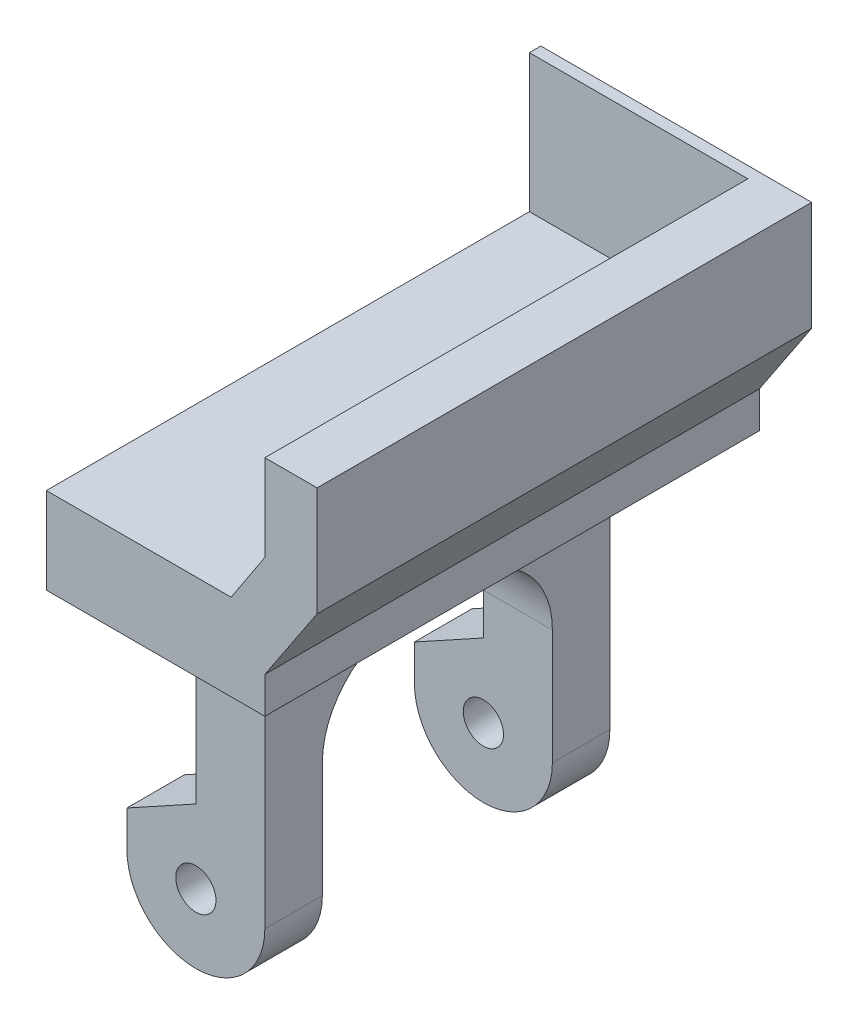
ISO-10303-21;
HEADER;
FILE_DESCRIPTION(('STEP AP214'),'2;1');
FILE_NAME('part.step','',(''),(''),'','','');
FILE_SCHEMA(('AUTOMOTIVE_DESIGN { 1 0 10303 214 1 1 1 1 }'));
ENDSEC;
DATA;
#1=APPLICATION_CONTEXT('core data for automotive mechanical design processes');
#2=APPLICATION_PROTOCOL_DEFINITION('international standard','automotive_design',2000,#1);
#3=PRODUCT_CONTEXT('',#1,'mechanical');
#4=PRODUCT('Part','Part','',(#3));
#5=PRODUCT_RELATED_PRODUCT_CATEGORY('part','',(#4));
#6=PRODUCT_DEFINITION_FORMATION('','',#4);
#7=PRODUCT_DEFINITION_CONTEXT('part definition',#1,'design');
#8=PRODUCT_DEFINITION('design','',#6,#7);
#9=PRODUCT_DEFINITION_SHAPE('','',#8);
#10=(LENGTH_UNIT() NAMED_UNIT(*) SI_UNIT(.MILLI.,.METRE.));
#11=(NAMED_UNIT(*) PLANE_ANGLE_UNIT() SI_UNIT($,.RADIAN.));
#12=(NAMED_UNIT(*) SI_UNIT($,.STERADIAN.) SOLID_ANGLE_UNIT());
#13=UNCERTAINTY_MEASURE_WITH_UNIT(LENGTH_MEASURE(1.E-05),#10,'distance_accuracy_value','');
#14=(GEOMETRIC_REPRESENTATION_CONTEXT(3) GLOBAL_UNCERTAINTY_ASSIGNED_CONTEXT((#13)) GLOBAL_UNIT_ASSIGNED_CONTEXT((#10,
#11,#12)) REPRESENTATION_CONTEXT('',''));
#15=CARTESIAN_POINT('',(0.,0.,0.));
#16=DIRECTION('',(0.,0.,1.));
#17=DIRECTION('',(1.,0.,0.));
#18=AXIS2_PLACEMENT_3D('',#15,#16,#17);
#19=CARTESIAN_POINT('',(0.,60.,0.));
#20=DIRECTION('',(0.,1.,0.));
#21=DIRECTION('',(0.,0.,1.));
#22=AXIS2_PLACEMENT_3D('',#19,#20,#21);
#23=PLANE('',#22);
#24=DIRECTION('',(0.,0.,1.));
#25=VECTOR('',#24,1.);
#26=CARTESIAN_POINT('',(19.1369547536123,60.,-12.));
#27=LINE('',#26,#25);
#28=CARTESIAN_POINT('',(19.1369547536123,60.,-11.));
#29=VERTEX_POINT('',#28);
#30=CARTESIAN_POINT('',(19.1369547536123,60.,73.));
#31=VERTEX_POINT('',#30);
#32=EDGE_CURVE('E271',#29,#31,#27,.T.);
#33=ORIENTED_EDGE('',*,*,#32,.F.);
#34=DIRECTION('',(-1.,0.,0.));
#35=VECTOR('',#34,1.);
#36=CARTESIAN_POINT('',(0.,60.,-11.));
#37=LINE('',#36,#35);
#38=CARTESIAN_POINT('',(-13.,60.,-11.));
#39=VERTEX_POINT('',#38);
#40=EDGE_CURVE('E248',#29,#39,#37,.T.);
#41=ORIENTED_EDGE('',*,*,#40,.T.);
#42=DIRECTION('',(0.,0.,1.));
#43=VECTOR('',#42,1.);
#44=CARTESIAN_POINT('',(-13.,60.,-13.));
#45=LINE('',#44,#43);
#46=CARTESIAN_POINT('',(-13.,60.,73.));
#47=VERTEX_POINT('',#46);
#48=EDGE_CURVE('E214',#39,#47,#45,.T.);
#49=ORIENTED_EDGE('',*,*,#48,.T.);
#50=DIRECTION('',(1.,0.,0.));
#51=VECTOR('',#50,1.);
#52=CARTESIAN_POINT('',(-13.,60.,73.));
#53=LINE('',#52,#51);
#54=EDGE_CURVE('E289',#47,#31,#53,.T.);
#55=ORIENTED_EDGE('',*,*,#54,.T.);
#56=EDGE_LOOP('',(#33,#41,#49,#55));
#57=FACE_BOUND('',#56,.T.);
#58=ADVANCED_FACE('F47',(#57),#23,.T.);
#59=CARTESIAN_POINT('',(25.,68.9267717162526,-12.));
#60=DIRECTION('',(-0.835839488356545,0.54897390621401,0.));
#61=DIRECTION('',(-0.54897390621401,-0.835839488356545,0.));
#62=AXIS2_PLACEMENT_3D('',#59,#60,#61);
#63=PLANE('',#62);
#64=DIRECTION('',(0.,0.,1.));
#65=VECTOR('',#64,1.);
#66=CARTESIAN_POINT('',(25.,68.9267717162526,-12.));
#67=LINE('',#66,#65);
#68=CARTESIAN_POINT('',(25.,68.9267717162526,-11.));
#69=VERTEX_POINT('',#68);
#70=CARTESIAN_POINT('',(25.,68.9267717162526,73.));
#71=VERTEX_POINT('',#70);
#72=EDGE_CURVE('E275',#69,#71,#67,.T.);
#73=ORIENTED_EDGE('',*,*,#72,.F.);
#74=DIRECTION('',(-0.54897390621401,-0.835839488356545,0.));
#75=VECTOR('',#74,1.);
#76=CARTESIAN_POINT('',(25.,68.9267717162526,-11.));
#77=LINE('',#76,#75);
#78=EDGE_CURVE('E63',#69,#29,#77,.T.);
#79=ORIENTED_EDGE('',*,*,#78,.T.);
#80=ORIENTED_EDGE('',*,*,#32,.T.);
#81=DIRECTION('',(-0.54897390621401,-0.835839488356545,0.));
#82=VECTOR('',#81,1.);
#83=CARTESIAN_POINT('',(25.,68.9267717162526,73.));
#84=LINE('',#83,#82);
#85=EDGE_CURVE('E267',#71,#31,#84,.T.);
#86=ORIENTED_EDGE('',*,*,#85,.F.);
#87=EDGE_LOOP('',(#73,#79,#80,#86));
#88=FACE_BOUND('',#87,.T.);
#89=ADVANCED_FACE('F560',(#88),#63,.T.);
#90=CARTESIAN_POINT('',(25.,83.9469624959183,-12.));
#91=DIRECTION('',(-1.,0.,0.));
#92=DIRECTION('',(0.,0.,1.));
#93=AXIS2_PLACEMENT_3D('',#90,#91,#92);
#94=PLANE('',#93);
#95=DIRECTION('',(0.,0.,1.));
#96=VECTOR('',#95,1.);
#97=CARTESIAN_POINT('',(25.,83.9469624959183,-12.));
#98=LINE('',#97,#96);
#99=CARTESIAN_POINT('',(25.,83.9469624959183,-11.));
#100=VERTEX_POINT('',#99);
#101=CARTESIAN_POINT('',(25.,83.9469624959183,73.));
#102=VERTEX_POINT('',#101);
#103=EDGE_CURVE('E278',#100,#102,#98,.T.);
#104=ORIENTED_EDGE('',*,*,#103,.F.);
#105=DIRECTION('',(0.,-1.,0.));
#106=VECTOR('',#105,1.);
#107=CARTESIAN_POINT('',(25.,83.9469624959183,-11.));
#108=LINE('',#107,#106);
#109=EDGE_CURVE('E228',#100,#69,#108,.T.);
#110=ORIENTED_EDGE('',*,*,#109,.T.);
#111=ORIENTED_EDGE('',*,*,#72,.T.);
#112=DIRECTION('',(0.,-1.,0.));
#113=VECTOR('',#112,1.);
#114=CARTESIAN_POINT('',(25.,83.9469624959183,73.));
#115=LINE('',#114,#113);
#116=EDGE_CURVE('E263',#102,#71,#115,.T.);
#117=ORIENTED_EDGE('',*,*,#116,.F.);
#118=EDGE_LOOP('',(#104,#110,#111,#117));
#119=FACE_BOUND('',#118,.T.);
#120=ADVANCED_FACE('F566',(#119),#94,.T.);
#121=CARTESIAN_POINT('',(0.,0.,50.));
#122=DIRECTION('',(0.,0.,-1.));
#123=DIRECTION('',(1.,0.,0.));
#124=AXIS2_PLACEMENT_3D('',#121,#122,#123);
#125=PLANE('',#124);
#126=DIRECTION('',(0.,-1.,0.));
#127=VECTOR('',#126,1.);
#128=CARTESIAN_POINT('',(0.,12.7959520691142,50.));
#129=LINE('',#128,#127);
#130=CARTESIAN_POINT('',(0.,20.,50.));
#131=VERTEX_POINT('',#130);
#132=CARTESIAN_POINT('',(0.,12.7959520691142,50.));
#133=VERTEX_POINT('',#132);
#134=EDGE_CURVE('E420',#131,#133,#129,.T.);
#135=ORIENTED_EDGE('',*,*,#134,.F.);
#136=DIRECTION('',(-1.,0.,0.));
#137=VECTOR('',#136,1.);
#138=CARTESIAN_POINT('',(12.,20.,50.));
#139=LINE('',#138,#137);
#140=CARTESIAN_POINT('',(12.,20.,50.));
#141=VERTEX_POINT('',#140);
#142=EDGE_CURVE('E472',#131,#141,#139,.F.);
#143=ORIENTED_EDGE('',*,*,#142,.T.);
#144=DIRECTION('',(0.,1.,0.));
#145=VECTOR('',#144,1.);
#146=CARTESIAN_POINT('',(12.,0.,50.));
#147=LINE('',#146,#145);
#148=CARTESIAN_POINT('',(12.,0.,50.));
#149=VERTEX_POINT('',#148);
#150=EDGE_CURVE('E415',#149,#141,#147,.T.);
#151=ORIENTED_EDGE('',*,*,#150,.F.);
#152=CARTESIAN_POINT('',(0.,0.,50.));
#153=DIRECTION('',(0.,0.,1.));
#154=DIRECTION('',(1.,0.,0.));
#155=AXIS2_PLACEMENT_3D('',#152,#153,#154);
#156=CIRCLE('',#155,12.);
#157=CARTESIAN_POINT('',(-12.,0.,50.));
#158=VERTEX_POINT('',#157);
#159=EDGE_CURVE('E411',#158,#149,#156,.T.);
#160=ORIENTED_EDGE('',*,*,#159,.F.);
#161=DIRECTION('',(0.,-1.,0.));
#162=VECTOR('',#161,1.);
#163=CARTESIAN_POINT('',(-12.,0.,50.));
#164=LINE('',#163,#162);
#165=CARTESIAN_POINT('',(-12.,6.18899999857538,50.));
#166=VERTEX_POINT('',#165);
#167=EDGE_CURVE('E427',#166,#158,#164,.T.);
#168=ORIENTED_EDGE('',*,*,#167,.F.);
#169=DIRECTION('',(-0.876001521762733,-0.482308339000453,0.));
#170=VECTOR('',#169,1.);
#171=CARTESIAN_POINT('',(-12.,6.18899999857538,50.));
#172=LINE('',#171,#170);
#173=EDGE_CURVE('E423',#133,#166,#172,.T.);
#174=ORIENTED_EDGE('',*,*,#173,.F.);
#175=EDGE_LOOP('',(#135,#143,#151,#160,#168,#174));
#176=FACE_BOUND('',#175,.T.);
#177=CARTESIAN_POINT('',(0.,0.,50.));
#178=DIRECTION('',(0.,0.,1.));
#179=DIRECTION('',(1.,0.,0.));
#180=AXIS2_PLACEMENT_3D('',#177,#178,#179);
#181=CIRCLE('',#180,3.5);
#182=CARTESIAN_POINT('',(3.5,0.,50.));
#183=VERTEX_POINT('',#182);
#184=EDGE_CURVE('E403',#183,#183,#181,.T.);
#185=ORIENTED_EDGE('',*,*,#184,.T.);
#186=EDGE_LOOP('',(#185));
#187=FACE_BOUND('',#186,.T.);
#188=ADVANCED_FACE('F491',(#176,#187),#125,.T.);
#189=CARTESIAN_POINT('',(0.,0.,60.));
#190=DIRECTION('',(0.,0.,-1.));
#191=DIRECTION('',(1.,0.,0.));
#192=AXIS2_PLACEMENT_3D('',#189,#190,#191);
#193=PLANE('',#192);
#194=CARTESIAN_POINT('',(0.,0.,60.));
#195=DIRECTION('',(0.,0.,1.));
#196=DIRECTION('',(1.,0.,0.));
#197=AXIS2_PLACEMENT_3D('',#194,#195,#196);
#198=CIRCLE('',#197,12.);
#199=CARTESIAN_POINT('',(-12.,0.,60.));
#200=VERTEX_POINT('',#199);
#201=CARTESIAN_POINT('',(12.,0.,60.));
#202=VERTEX_POINT('',#201);
#203=EDGE_CURVE('E407',#200,#202,#198,.T.);
#204=ORIENTED_EDGE('',*,*,#203,.T.);
#205=DIRECTION('',(0.,1.,0.));
#206=VECTOR('',#205,1.);
#207=CARTESIAN_POINT('',(12.,0.,60.));
#208=LINE('',#207,#206);
#209=CARTESIAN_POINT('',(12.,45.,60.));
#210=VERTEX_POINT('',#209);
#211=EDGE_CURVE('E435',#202,#210,#208,.T.);
#212=ORIENTED_EDGE('',*,*,#211,.T.);
#213=DIRECTION('',(1.,0.,0.));
#214=VECTOR('',#213,1.);
#215=CARTESIAN_POINT('',(0.,45.,60.));
#216=LINE('',#215,#214);
#217=CARTESIAN_POINT('',(0.,45.,60.));
#218=VERTEX_POINT('',#217);
#219=EDGE_CURVE('E392',#218,#210,#216,.T.);
#220=ORIENTED_EDGE('',*,*,#219,.F.);
#221=DIRECTION('',(0.,-1.,0.));
#222=VECTOR('',#221,1.);
#223=CARTESIAN_POINT('',(0.,12.7959520691142,60.));
#224=LINE('',#223,#222);
#225=CARTESIAN_POINT('',(0.,12.7959520691142,60.));
#226=VERTEX_POINT('',#225);
#227=EDGE_CURVE('E439',#218,#226,#224,.T.);
#228=ORIENTED_EDGE('',*,*,#227,.T.);
#229=DIRECTION('',(-0.876001521762733,-0.482308339000453,0.));
#230=VECTOR('',#229,1.);
#231=CARTESIAN_POINT('',(-12.,6.18899999857538,60.));
#232=LINE('',#231,#230);
#233=CARTESIAN_POINT('',(-12.,6.18899999857538,60.));
#234=VERTEX_POINT('',#233);
#235=EDGE_CURVE('E443',#226,#234,#232,.T.);
#236=ORIENTED_EDGE('',*,*,#235,.T.);
#237=DIRECTION('',(0.,-1.,0.));
#238=VECTOR('',#237,1.);
#239=CARTESIAN_POINT('',(-12.,0.,60.));
#240=LINE('',#239,#238);
#241=EDGE_CURVE('E416',#234,#200,#240,.T.);
#242=ORIENTED_EDGE('',*,*,#241,.T.);
#243=EDGE_LOOP('',(#204,#212,#220,#228,#236,#242));
#244=FACE_BOUND('',#243,.T.);
#245=CARTESIAN_POINT('',(0.,0.,60.));
#246=DIRECTION('',(0.,0.,1.));
#247=DIRECTION('',(1.,0.,0.));
#248=AXIS2_PLACEMENT_3D('',#245,#246,#247);
#249=CIRCLE('',#248,3.5);
#250=CARTESIAN_POINT('',(3.5,0.,60.));
#251=VERTEX_POINT('',#250);
#252=EDGE_CURVE('E402',#251,#251,#249,.T.);
#253=ORIENTED_EDGE('',*,*,#252,.F.);
#254=EDGE_LOOP('',(#253));
#255=FACE_BOUND('',#254,.T.);
#256=ADVANCED_FACE('F525',(#244,#255),#193,.F.);
#257=CARTESIAN_POINT('',(0.,0.,50.));
#258=DIRECTION('',(0.,0.,1.));
#259=DIRECTION('',(-1.,0.,0.));
#260=AXIS2_PLACEMENT_3D('',#257,#258,#259);
#261=CYLINDRICAL_SURFACE('',#260,12.);
#262=ORIENTED_EDGE('',*,*,#203,.F.);
#263=DIRECTION('',(0.,0.,1.));
#264=VECTOR('',#263,1.);
#265=CARTESIAN_POINT('',(-12.,0.,50.));
#266=LINE('',#265,#264);
#267=EDGE_CURVE('E431',#158,#200,#266,.T.);
#268=ORIENTED_EDGE('',*,*,#267,.F.);
#269=ORIENTED_EDGE('',*,*,#159,.T.);
#270=DIRECTION('',(0.,0.,1.));
#271=VECTOR('',#270,1.);
#272=CARTESIAN_POINT('',(12.,0.,50.));
#273=LINE('',#272,#271);
#274=EDGE_CURVE('E458',#149,#202,#273,.T.);
#275=ORIENTED_EDGE('',*,*,#274,.T.);
#276=EDGE_LOOP('',(#262,#268,#269,#275));
#277=FACE_BOUND('',#276,.T.);
#278=ADVANCED_FACE('F530',(#277),#261,.T.);
#279=CARTESIAN_POINT('',(12.,0.,50.));
#280=DIRECTION('',(-1.,0.,0.));
#281=DIRECTION('',(0.,0.,-1.));
#282=AXIS2_PLACEMENT_3D('',#279,#280,#281);
#283=PLANE('',#282);
#284=ORIENTED_EDGE('',*,*,#211,.F.);
#285=ORIENTED_EDGE('',*,*,#274,.F.);
#286=ORIENTED_EDGE('',*,*,#150,.T.);
#287=CARTESIAN_POINT('',(12.,20.,35.));
#288=DIRECTION('',(-1.,0.,0.));
#289=DIRECTION('',(0.,0.,1.));
#290=AXIS2_PLACEMENT_3D('',#287,#288,#289);
#291=CIRCLE('',#290,15.);
#292=CARTESIAN_POINT('',(12.,35.,35.));
#293=VERTEX_POINT('',#292);
#294=EDGE_CURVE('E11',#141,#293,#291,.T.);
#295=ORIENTED_EDGE('',*,*,#294,.T.);
#296=DIRECTION('',(0.,0.,1.));
#297=VECTOR('',#296,1.);
#298=CARTESIAN_POINT('',(12.,35.,10.));
#299=LINE('',#298,#297);
#300=CARTESIAN_POINT('',(12.,35.,25.));
#301=VERTEX_POINT('',#300);
#302=EDGE_CURVE('E321',#301,#293,#299,.T.);
#303=ORIENTED_EDGE('',*,*,#302,.F.);
#304=CARTESIAN_POINT('',(12.,20.,25.));
#305=DIRECTION('',(-1.,0.,0.));
#306=DIRECTION('',(0.,0.,1.));
#307=AXIS2_PLACEMENT_3D('',#304,#305,#306);
#308=CIRCLE('',#307,15.);
#309=CARTESIAN_POINT('',(12.,20.,10.));
#310=VERTEX_POINT('',#309);
#311=EDGE_CURVE('E475',#301,#310,#308,.T.);
#312=ORIENTED_EDGE('',*,*,#311,.T.);
#313=DIRECTION('',(0.,1.,0.));
#314=VECTOR('',#313,1.);
#315=CARTESIAN_POINT('',(12.,0.,10.));
#316=LINE('',#315,#314);
#317=CARTESIAN_POINT('',(12.,0.,10.));
#318=VERTEX_POINT('',#317);
#319=EDGE_CURVE('E342',#318,#310,#316,.T.);
#320=ORIENTED_EDGE('',*,*,#319,.F.);
#321=DIRECTION('',(0.,0.,-1.));
#322=VECTOR('',#321,1.);
#323=CARTESIAN_POINT('',(12.,0.,10.));
#324=LINE('',#323,#322);
#325=CARTESIAN_POINT('',(12.,0.,0.));
#326=VERTEX_POINT('',#325);
#327=EDGE_CURVE('E376',#318,#326,#324,.T.);
#328=ORIENTED_EDGE('',*,*,#327,.T.);
#329=DIRECTION('',(0.,-1.,0.));
#330=VECTOR('',#329,1.);
#331=CARTESIAN_POINT('',(12.,45.,0.));
#332=LINE('',#331,#330);
#333=CARTESIAN_POINT('',(12.,45.,0.));
#334=VERTEX_POINT('',#333);
#335=EDGE_CURVE('E399',#334,#326,#332,.T.);
#336=ORIENTED_EDGE('',*,*,#335,.F.);
#337=DIRECTION('',(0.,0.,-1.));
#338=VECTOR('',#337,1.);
#339=CARTESIAN_POINT('',(12.,45.,10.));
#340=LINE('',#339,#338);
#341=EDGE_CURVE('E380',#210,#334,#340,.T.);
#342=ORIENTED_EDGE('',*,*,#341,.F.);
#343=EDGE_LOOP('',(#284,#285,#286,#295,#303,#312,#320,#328,#336,#342));
#344=FACE_BOUND('',#343,.T.);
#345=ADVANCED_FACE('F499',(#344),#283,.F.);
#346=CARTESIAN_POINT('',(0.,12.7959520691142,50.));
#347=DIRECTION('',(1.,0.,0.));
#348=DIRECTION('',(0.,0.,1.));
#349=AXIS2_PLACEMENT_3D('',#346,#347,#348);
#350=PLANE('',#349);
#351=DIRECTION('',(0.,0.,-1.));
#352=VECTOR('',#351,1.);
#353=CARTESIAN_POINT('',(0.,35.,50.));
#354=LINE('',#353,#352);
#355=CARTESIAN_POINT('',(0.,35.,35.));
#356=VERTEX_POINT('',#355);
#357=CARTESIAN_POINT('',(0.,35.,25.));
#358=VERTEX_POINT('',#357);
#359=EDGE_CURVE('E325',#356,#358,#354,.T.);
#360=ORIENTED_EDGE('',*,*,#359,.F.);
#361=CARTESIAN_POINT('',(0.,20.,35.));
#362=DIRECTION('',(1.,0.,0.));
#363=DIRECTION('',(0.,0.,-1.));
#364=AXIS2_PLACEMENT_3D('',#361,#362,#363);
#365=CIRCLE('',#364,15.);
#366=EDGE_CURVE('E56',#356,#131,#365,.T.);
#367=ORIENTED_EDGE('',*,*,#366,.T.);
#368=ORIENTED_EDGE('',*,*,#134,.T.);
#369=DIRECTION('',(0.,0.,1.));
#370=VECTOR('',#369,1.);
#371=CARTESIAN_POINT('',(0.,12.7959520691142,50.));
#372=LINE('',#371,#370);
#373=EDGE_CURVE('E455',#133,#226,#372,.T.);
#374=ORIENTED_EDGE('',*,*,#373,.T.);
#375=ORIENTED_EDGE('',*,*,#227,.F.);
#376=DIRECTION('',(0.,0.,1.));
#377=VECTOR('',#376,1.);
#378=CARTESIAN_POINT('',(0.,45.,0.));
#379=LINE('',#378,#377);
#380=CARTESIAN_POINT('',(0.,45.,0.));
#381=VERTEX_POINT('',#380);
#382=EDGE_CURVE('E388',#381,#218,#379,.T.);
#383=ORIENTED_EDGE('',*,*,#382,.F.);
#384=DIRECTION('',(0.,-1.,0.));
#385=VECTOR('',#384,1.);
#386=CARTESIAN_POINT('',(0.,45.,0.));
#387=LINE('',#386,#385);
#388=CARTESIAN_POINT('',(0.,12.7959520691142,0.));
#389=VERTEX_POINT('',#388);
#390=EDGE_CURVE('E396',#381,#389,#387,.T.);
#391=ORIENTED_EDGE('',*,*,#390,.T.);
#392=DIRECTION('',(0.,0.,-1.));
#393=VECTOR('',#392,1.);
#394=CARTESIAN_POINT('',(0.,12.7959520691142,10.));
#395=LINE('',#394,#393);
#396=CARTESIAN_POINT('',(0.,12.7959520691142,10.));
#397=VERTEX_POINT('',#396);
#398=EDGE_CURVE('E372',#397,#389,#395,.T.);
#399=ORIENTED_EDGE('',*,*,#398,.F.);
#400=DIRECTION('',(0.,-1.,0.));
#401=VECTOR('',#400,1.);
#402=CARTESIAN_POINT('',(0.,12.7959520691142,10.));
#403=LINE('',#402,#401);
#404=CARTESIAN_POINT('',(0.,20.,10.));
#405=VERTEX_POINT('',#404);
#406=EDGE_CURVE('E347',#405,#397,#403,.T.);
#407=ORIENTED_EDGE('',*,*,#406,.F.);
#408=CARTESIAN_POINT('',(0.,20.,25.));
#409=DIRECTION('',(1.,0.,0.));
#410=DIRECTION('',(0.,0.,-1.));
#411=AXIS2_PLACEMENT_3D('',#408,#409,#410);
#412=CIRCLE('',#411,15.);
#413=EDGE_CURVE('E478',#405,#358,#412,.T.);
#414=ORIENTED_EDGE('',*,*,#413,.T.);
#415=EDGE_LOOP('',(#360,#367,#368,#374,#375,#383,#391,#399,#407,#414));
#416=FACE_BOUND('',#415,.T.);
#417=ADVANCED_FACE('F484',(#416),#350,.F.);
#418=CARTESIAN_POINT('',(-12.,6.18899999857538,50.));
#419=DIRECTION('',(0.482308339000453,-0.876001521762733,0.));
#420=DIRECTION('',(0.876001521762733,0.482308339000453,0.));
#421=AXIS2_PLACEMENT_3D('',#418,#419,#420);
#422=PLANE('',#421);
#423=ORIENTED_EDGE('',*,*,#235,.F.);
#424=ORIENTED_EDGE('',*,*,#373,.F.);
#425=ORIENTED_EDGE('',*,*,#173,.T.);
#426=DIRECTION('',(0.,0.,1.));
#427=VECTOR('',#426,1.);
#428=CARTESIAN_POINT('',(-12.,6.18899999857538,50.));
#429=LINE('',#428,#427);
#430=EDGE_CURVE('E452',#166,#234,#429,.T.);
#431=ORIENTED_EDGE('',*,*,#430,.T.);
#432=EDGE_LOOP('',(#423,#424,#425,#431));
#433=FACE_BOUND('',#432,.T.);
#434=ADVANCED_FACE('F536',(#433),#422,.F.);
#435=CARTESIAN_POINT('',(-12.,0.,50.));
#436=DIRECTION('',(1.,0.,0.));
#437=DIRECTION('',(0.,0.,1.));
#438=AXIS2_PLACEMENT_3D('',#435,#436,#437);
#439=PLANE('',#438);
#440=ORIENTED_EDGE('',*,*,#241,.F.);
#441=ORIENTED_EDGE('',*,*,#430,.F.);
#442=ORIENTED_EDGE('',*,*,#167,.T.);
#443=ORIENTED_EDGE('',*,*,#267,.T.);
#444=EDGE_LOOP('',(#440,#441,#442,#443));
#445=FACE_BOUND('',#444,.T.);
#446=ADVANCED_FACE('F533',(#445),#439,.F.);
#447=CARTESIAN_POINT('',(0.,0.,50.));
#448=DIRECTION('',(0.,0.,1.));
#449=DIRECTION('',(-1.,0.,0.));
#450=AXIS2_PLACEMENT_3D('',#447,#448,#449);
#451=CYLINDRICAL_SURFACE('',#450,3.5);
#452=ORIENTED_EDGE('',*,*,#184,.F.);
#453=EDGE_LOOP('',(#452));
#454=FACE_BOUND('',#453,.T.);
#455=ORIENTED_EDGE('',*,*,#252,.T.);
#456=EDGE_LOOP('',(#455));
#457=FACE_BOUND('',#456,.T.);
#458=ADVANCED_FACE('F597',(#454,#457),#451,.F.);
#459=CARTESIAN_POINT('',(12.,45.,0.));
#460=DIRECTION('',(0.,0.,1.));
#461=DIRECTION('',(1.,0.,0.));
#462=AXIS2_PLACEMENT_3D('',#459,#460,#461);
#463=PLANE('',#462);
#464=ORIENTED_EDGE('',*,*,#335,.T.);
#465=CARTESIAN_POINT('',(0.,0.,0.));
#466=DIRECTION('',(0.,0.,1.));
#467=DIRECTION('',(1.,0.,0.));
#468=AXIS2_PLACEMENT_3D('',#465,#466,#467);
#469=CIRCLE('',#468,12.);
#470=CARTESIAN_POINT('',(-12.,0.,0.));
#471=VERTEX_POINT('',#470);
#472=EDGE_CURVE('E334',#471,#326,#469,.T.);
#473=ORIENTED_EDGE('',*,*,#472,.F.);
#474=DIRECTION('',(0.,-1.,0.));
#475=VECTOR('',#474,1.);
#476=CARTESIAN_POINT('',(-12.,0.,0.));
#477=LINE('',#476,#475);
#478=CARTESIAN_POINT('',(-12.,6.18899999857538,0.));
#479=VERTEX_POINT('',#478);
#480=EDGE_CURVE('E343',#479,#471,#477,.T.);
#481=ORIENTED_EDGE('',*,*,#480,.F.);
#482=DIRECTION('',(-0.876001521762733,-0.482308339000453,0.));
#483=VECTOR('',#482,1.);
#484=CARTESIAN_POINT('',(-12.,6.18899999857538,0.));
#485=LINE('',#484,#483);
#486=EDGE_CURVE('E360',#389,#479,#485,.T.);
#487=ORIENTED_EDGE('',*,*,#486,.F.);
#488=ORIENTED_EDGE('',*,*,#390,.F.);
#489=DIRECTION('',(-1.,0.,0.));
#490=VECTOR('',#489,1.);
#491=CARTESIAN_POINT('',(12.,45.,0.));
#492=LINE('',#491,#490);
#493=EDGE_CURVE('E384',#334,#381,#492,.T.);
#494=ORIENTED_EDGE('',*,*,#493,.F.);
#495=EDGE_LOOP('',(#464,#473,#481,#487,#488,#494));
#496=FACE_BOUND('',#495,.T.);
#497=CARTESIAN_POINT('',(0.,0.,0.));
#498=DIRECTION('',(0.,0.,1.));
#499=DIRECTION('',(1.,0.,0.));
#500=AXIS2_PLACEMENT_3D('',#497,#498,#499);
#501=CIRCLE('',#500,3.5);
#502=CARTESIAN_POINT('',(3.5,0.,0.));
#503=VERTEX_POINT('',#502);
#504=EDGE_CURVE('E329',#503,#503,#501,.T.);
#505=ORIENTED_EDGE('',*,*,#504,.T.);
#506=EDGE_LOOP('',(#505));
#507=FACE_BOUND('',#506,.T.);
#508=ADVANCED_FACE('F544',(#496,#507),#463,.F.);
#509=CARTESIAN_POINT('',(0.,0.,10.));
#510=DIRECTION('',(0.,0.,1.));
#511=DIRECTION('',(1.,0.,0.));
#512=AXIS2_PLACEMENT_3D('',#509,#510,#511);
#513=PLANE('',#512);
#514=ORIENTED_EDGE('',*,*,#319,.T.);
#515=DIRECTION('',(1.,0.,0.));
#516=VECTOR('',#515,1.);
#517=CARTESIAN_POINT('',(0.,20.,10.));
#518=LINE('',#517,#516);
#519=EDGE_CURVE('E469',#310,#405,#518,.F.);
#520=ORIENTED_EDGE('',*,*,#519,.T.);
#521=ORIENTED_EDGE('',*,*,#406,.T.);
#522=DIRECTION('',(-0.876001521762733,-0.482308339000453,0.));
#523=VECTOR('',#522,1.);
#524=CARTESIAN_POINT('',(-12.,6.18899999857538,10.));
#525=LINE('',#524,#523);
#526=CARTESIAN_POINT('',(-12.,6.18899999857538,10.));
#527=VERTEX_POINT('',#526);
#528=EDGE_CURVE('E350',#397,#527,#525,.T.);
#529=ORIENTED_EDGE('',*,*,#528,.T.);
#530=DIRECTION('',(0.,-1.,0.));
#531=VECTOR('',#530,1.);
#532=CARTESIAN_POINT('',(-12.,0.,10.));
#533=LINE('',#532,#531);
#534=CARTESIAN_POINT('',(-12.,0.,10.));
#535=VERTEX_POINT('',#534);
#536=EDGE_CURVE('E353',#527,#535,#533,.T.);
#537=ORIENTED_EDGE('',*,*,#536,.T.);
#538=CARTESIAN_POINT('',(0.,0.,10.));
#539=DIRECTION('',(0.,0.,1.));
#540=DIRECTION('',(1.,0.,0.));
#541=AXIS2_PLACEMENT_3D('',#538,#539,#540);
#542=CIRCLE('',#541,12.);
#543=EDGE_CURVE('E338',#535,#318,#542,.T.);
#544=ORIENTED_EDGE('',*,*,#543,.T.);
#545=EDGE_LOOP('',(#514,#520,#521,#529,#537,#544));
#546=FACE_BOUND('',#545,.T.);
#547=CARTESIAN_POINT('',(0.,0.,10.));
#548=DIRECTION('',(0.,0.,1.));
#549=DIRECTION('',(1.,0.,0.));
#550=AXIS2_PLACEMENT_3D('',#547,#548,#549);
#551=CIRCLE('',#550,3.5);
#552=CARTESIAN_POINT('',(3.5,0.,10.));
#553=VERTEX_POINT('',#552);
#554=EDGE_CURVE('E330',#553,#553,#551,.T.);
#555=ORIENTED_EDGE('',*,*,#554,.F.);
#556=EDGE_LOOP('',(#555));
#557=FACE_BOUND('',#556,.T.);
#558=ADVANCED_FACE('F508',(#546,#557),#513,.T.);
#559=CARTESIAN_POINT('',(0.,0.,10.));
#560=DIRECTION('',(0.,0.,-1.));
#561=DIRECTION('',(-1.,0.,0.));
#562=AXIS2_PLACEMENT_3D('',#559,#560,#561);
#563=CYLINDRICAL_SURFACE('',#562,12.);
#564=ORIENTED_EDGE('',*,*,#472,.T.);
#565=ORIENTED_EDGE('',*,*,#327,.F.);
#566=ORIENTED_EDGE('',*,*,#543,.F.);
#567=DIRECTION('',(0.,0.,-1.));
#568=VECTOR('',#567,1.);
#569=CARTESIAN_POINT('',(-12.,0.,10.));
#570=LINE('',#569,#568);
#571=EDGE_CURVE('E356',#535,#471,#570,.T.);
#572=ORIENTED_EDGE('',*,*,#571,.T.);
#573=EDGE_LOOP('',(#564,#565,#566,#572));
#574=FACE_BOUND('',#573,.T.);
#575=ADVANCED_FACE('F516',(#574),#563,.T.);
#576=CARTESIAN_POINT('',(-12.,6.18899999857538,10.));
#577=DIRECTION('',(0.482308339000453,-0.876001521762733,0.));
#578=DIRECTION('',(0.876001521762733,0.482308339000453,0.));
#579=AXIS2_PLACEMENT_3D('',#576,#577,#578);
#580=PLANE('',#579);
#581=ORIENTED_EDGE('',*,*,#486,.T.);
#582=DIRECTION('',(0.,0.,-1.));
#583=VECTOR('',#582,1.);
#584=CARTESIAN_POINT('',(-12.,6.18899999857538,10.));
#585=LINE('',#584,#583);
#586=EDGE_CURVE('E368',#527,#479,#585,.T.);
#587=ORIENTED_EDGE('',*,*,#586,.F.);
#588=ORIENTED_EDGE('',*,*,#528,.F.);
#589=ORIENTED_EDGE('',*,*,#398,.T.);
#590=EDGE_LOOP('',(#581,#587,#588,#589));
#591=FACE_BOUND('',#590,.T.);
#592=ADVANCED_FACE('F541',(#591),#580,.F.);
#593=CARTESIAN_POINT('',(-12.,0.,10.));
#594=DIRECTION('',(1.,0.,0.));
#595=DIRECTION('',(0.,0.,-1.));
#596=AXIS2_PLACEMENT_3D('',#593,#594,#595);
#597=PLANE('',#596);
#598=ORIENTED_EDGE('',*,*,#480,.T.);
#599=ORIENTED_EDGE('',*,*,#571,.F.);
#600=ORIENTED_EDGE('',*,*,#536,.F.);
#601=ORIENTED_EDGE('',*,*,#586,.T.);
#602=EDGE_LOOP('',(#598,#599,#600,#601));
#603=FACE_BOUND('',#602,.T.);
#604=ADVANCED_FACE('F547',(#603),#597,.F.);
#605=CARTESIAN_POINT('',(0.,0.,10.));
#606=DIRECTION('',(0.,0.,-1.));
#607=DIRECTION('',(-1.,0.,0.));
#608=AXIS2_PLACEMENT_3D('',#605,#606,#607);
#609=CYLINDRICAL_SURFACE('',#608,3.5);
#610=ORIENTED_EDGE('',*,*,#554,.T.);
#611=EDGE_LOOP('',(#610));
#612=FACE_BOUND('',#611,.T.);
#613=ORIENTED_EDGE('',*,*,#504,.F.);
#614=EDGE_LOOP('',(#613));
#615=FACE_BOUND('',#614,.T.);
#616=ADVANCED_FACE('F549',(#612,#615),#609,.F.);
#617=CARTESIAN_POINT('',(0.,35.,0.));
#618=DIRECTION('',(0.,-1.,0.));
#619=DIRECTION('',(0.,0.,-1.));
#620=AXIS2_PLACEMENT_3D('',#617,#618,#619);
#621=PLANE('',#620);
#622=ORIENTED_EDGE('',*,*,#359,.T.);
#623=DIRECTION('',(1.,0.,0.));
#624=VECTOR('',#623,1.);
#625=CARTESIAN_POINT('',(12.,35.,25.));
#626=LINE('',#625,#624);
#627=EDGE_CURVE('E465',#358,#301,#626,.T.);
#628=ORIENTED_EDGE('',*,*,#627,.T.);
#629=ORIENTED_EDGE('',*,*,#302,.T.);
#630=DIRECTION('',(-1.,0.,0.));
#631=VECTOR('',#630,1.);
#632=CARTESIAN_POINT('',(0.,35.,35.));
#633=LINE('',#632,#631);
#634=EDGE_CURVE('E461',#293,#356,#633,.T.);
#635=ORIENTED_EDGE('',*,*,#634,.T.);
#636=EDGE_LOOP('',(#622,#628,#629,#635));
#637=FACE_BOUND('',#636,.T.);
#638=ADVANCED_FACE('F501',(#637),#621,.T.);
#639=CARTESIAN_POINT('',(0.,20.,25.));
#640=DIRECTION('',(-1.,0.,0.));
#641=DIRECTION('',(0.,0.,1.));
#642=AXIS2_PLACEMENT_3D('',#639,#640,#641);
#643=CYLINDRICAL_SURFACE('',#642,15.);
#644=ORIENTED_EDGE('',*,*,#413,.F.);
#645=ORIENTED_EDGE('',*,*,#519,.F.);
#646=ORIENTED_EDGE('',*,*,#311,.F.);
#647=ORIENTED_EDGE('',*,*,#627,.F.);
#648=EDGE_LOOP('',(#644,#645,#646,#647));
#649=FACE_BOUND('',#648,.T.);
#650=ADVANCED_FACE('F505',(#649),#643,.F.);
#651=CARTESIAN_POINT('',(0.,20.,35.));
#652=DIRECTION('',(1.,0.,0.));
#653=DIRECTION('',(0.,0.,-1.));
#654=AXIS2_PLACEMENT_3D('',#651,#652,#653);
#655=CYLINDRICAL_SURFACE('',#654,15.);
#656=ORIENTED_EDGE('',*,*,#294,.F.);
#657=ORIENTED_EDGE('',*,*,#142,.F.);
#658=ORIENTED_EDGE('',*,*,#366,.F.);
#659=ORIENTED_EDGE('',*,*,#634,.F.);
#660=EDGE_LOOP('',(#656,#657,#658,#659));
#661=FACE_BOUND('',#660,.T.);
#662=ADVANCED_FACE('F49',(#661),#655,.F.);
#663=CARTESIAN_POINT('',(0.,45.,0.));
#664=DIRECTION('',(0.,1.,0.));
#665=DIRECTION('',(0.,0.,1.));
#666=AXIS2_PLACEMENT_3D('',#663,#664,#665);
#667=PLANE('',#666);
#668=DIRECTION('',(-1.,0.,0.));
#669=VECTOR('',#668,1.);
#670=CARTESIAN_POINT('',(25.,45.,-13.));
#671=LINE('',#670,#669);
#672=CARTESIAN_POINT('',(25.,45.,-13.));
#673=VERTEX_POINT('',#672);
#674=CARTESIAN_POINT('',(-13.,45.,-13.));
#675=VERTEX_POINT('',#674);
#676=EDGE_CURVE('E303',#673,#675,#671,.T.);
#677=ORIENTED_EDGE('',*,*,#676,.F.);
#678=DIRECTION('',(0.,0.,-1.));
#679=VECTOR('',#678,1.);
#680=CARTESIAN_POINT('',(25.,45.,73.));
#681=LINE('',#680,#679);
#682=CARTESIAN_POINT('',(25.,45.,73.));
#683=VERTEX_POINT('',#682);
#684=EDGE_CURVE('E300',#683,#673,#681,.T.);
#685=ORIENTED_EDGE('',*,*,#684,.F.);
#686=DIRECTION('',(1.,0.,0.));
#687=VECTOR('',#686,1.);
#688=CARTESIAN_POINT('',(-13.,45.,73.));
#689=LINE('',#688,#687);
#690=CARTESIAN_POINT('',(-13.,45.,73.));
#691=VERTEX_POINT('',#690);
#692=EDGE_CURVE('E274',#691,#683,#689,.T.);
#693=ORIENTED_EDGE('',*,*,#692,.F.);
#694=DIRECTION('',(0.,0.,1.));
#695=VECTOR('',#694,1.);
#696=CARTESIAN_POINT('',(-13.,45.,-13.));
#697=LINE('',#696,#695);
#698=EDGE_CURVE('E293',#675,#691,#697,.T.);
#699=ORIENTED_EDGE('',*,*,#698,.F.);
#700=EDGE_LOOP('',(#677,#685,#693,#699));
#701=FACE_BOUND('',#700,.T.);
#702=ORIENTED_EDGE('',*,*,#219,.T.);
#703=ORIENTED_EDGE('',*,*,#341,.T.);
#704=ORIENTED_EDGE('',*,*,#493,.T.);
#705=ORIENTED_EDGE('',*,*,#382,.T.);
#706=EDGE_LOOP('',(#702,#703,#704,#705));
#707=FACE_BOUND('',#706,.T.);
#708=ADVANCED_FACE('F521',(#701,#707),#667,.F.);
#709=CARTESIAN_POINT('',(-13.,60.,73.));
#710=DIRECTION('',(0.,0.,-1.));
#711=DIRECTION('',(-1.,0.,0.));
#712=AXIS2_PLACEMENT_3D('',#709,#710,#711);
#713=PLANE('',#712);
#714=DIRECTION('',(0.,-1.,0.));
#715=VECTOR('',#714,1.);
#716=CARTESIAN_POINT('',(25.,60.,73.));
#717=LINE('',#716,#715);
#718=CARTESIAN_POINT('',(25.,51.312184347372,73.));
#719=VERTEX_POINT('',#718);
#720=EDGE_CURVE('E318',#719,#683,#717,.T.);
#721=ORIENTED_EDGE('',*,*,#720,.F.);
#722=DIRECTION('',(0.554102279177551,0.832448595536231,0.));
#723=VECTOR('',#722,1.);
#724=CARTESIAN_POINT('',(25.,51.312184347372,73.));
#725=LINE('',#724,#723);
#726=CARTESIAN_POINT('',(34.0889826703825,64.9669032379772,73.));
#727=VERTEX_POINT('',#726);
#728=EDGE_CURVE('E251',#719,#727,#725,.T.);
#729=ORIENTED_EDGE('',*,*,#728,.T.);
#730=DIRECTION('',(0.,1.,0.));
#731=VECTOR('',#730,1.);
#732=CARTESIAN_POINT('',(34.0889826703825,64.9669032379772,73.));
#733=LINE('',#732,#731);
#734=CARTESIAN_POINT('',(34.0889826703825,83.9469624959183,73.));
#735=VERTEX_POINT('',#734);
#736=EDGE_CURVE('E255',#727,#735,#733,.T.);
#737=ORIENTED_EDGE('',*,*,#736,.T.);
#738=DIRECTION('',(-1.,0.,0.));
#739=VECTOR('',#738,1.);
#740=CARTESIAN_POINT('',(34.0889826703825,83.9469624959183,73.));
#741=LINE('',#740,#739);
#742=EDGE_CURVE('E259',#735,#102,#741,.T.);
#743=ORIENTED_EDGE('',*,*,#742,.T.);
#744=ORIENTED_EDGE('',*,*,#116,.T.);
#745=ORIENTED_EDGE('',*,*,#85,.T.);
#746=ORIENTED_EDGE('',*,*,#54,.F.);
#747=DIRECTION('',(0.,-1.,0.));
#748=VECTOR('',#747,1.);
#749=CARTESIAN_POINT('',(-13.,60.,73.));
#750=LINE('',#749,#748);
#751=EDGE_CURVE('E296',#47,#691,#750,.T.);
#752=ORIENTED_EDGE('',*,*,#751,.T.);
#753=ORIENTED_EDGE('',*,*,#692,.T.);
#754=EDGE_LOOP('',(#721,#729,#737,#743,#744,#745,#746,#752,#753));
#755=FACE_BOUND('',#754,.T.);
#756=ADVANCED_FACE('F576',(#755),#713,.F.);
#757=CARTESIAN_POINT('',(25.,60.,73.));
#758=DIRECTION('',(-1.,0.,0.));
#759=DIRECTION('',(0.,0.,1.));
#760=AXIS2_PLACEMENT_3D('',#757,#758,#759);
#761=PLANE('',#760);
#762=DIRECTION('',(0.,-1.,0.));
#763=VECTOR('',#762,1.);
#764=CARTESIAN_POINT('',(25.,60.,-13.));
#765=LINE('',#764,#763);
#766=CARTESIAN_POINT('',(25.,51.312184347372,-13.));
#767=VERTEX_POINT('',#766);
#768=EDGE_CURVE('E314',#767,#673,#765,.T.);
#769=ORIENTED_EDGE('',*,*,#768,.F.);
#770=DIRECTION('',(0.,0.,1.));
#771=VECTOR('',#770,1.);
#772=CARTESIAN_POINT('',(25.,51.312184347372,-12.));
#773=LINE('',#772,#771);
#774=EDGE_CURVE('E71',#767,#719,#773,.T.);
#775=ORIENTED_EDGE('',*,*,#774,.T.);
#776=ORIENTED_EDGE('',*,*,#720,.T.);
#777=ORIENTED_EDGE('',*,*,#684,.T.);
#778=EDGE_LOOP('',(#769,#775,#776,#777));
#779=FACE_BOUND('',#778,.T.);
#780=ADVANCED_FACE('F583',(#779),#761,.F.);
#781=CARTESIAN_POINT('',(25.,60.,-13.));
#782=DIRECTION('',(0.,0.,1.));
#783=DIRECTION('',(1.,0.,0.));
#784=AXIS2_PLACEMENT_3D('',#781,#782,#783);
#785=PLANE('',#784);
#786=DIRECTION('',(-0.554102279177551,-0.832448595536231,0.));
#787=VECTOR('',#786,1.);
#788=CARTESIAN_POINT('',(34.0889826703825,64.9669032379772,-13.));
#789=LINE('',#788,#787);
#790=CARTESIAN_POINT('',(34.0889826703825,64.9669032379772,-13.));
#791=VERTEX_POINT('',#790);
#792=EDGE_CURVE('E238',#791,#767,#789,.T.);
#793=ORIENTED_EDGE('',*,*,#792,.T.);
#794=ORIENTED_EDGE('',*,*,#768,.T.);
#795=ORIENTED_EDGE('',*,*,#676,.T.);
#796=DIRECTION('',(0.,-1.,0.));
#797=VECTOR('',#796,1.);
#798=CARTESIAN_POINT('',(-13.,60.,-13.));
#799=LINE('',#798,#797);
#800=CARTESIAN_POINT('',(-13.,83.9469624959183,-13.));
#801=VERTEX_POINT('',#800);
#802=EDGE_CURVE('E311',#801,#675,#799,.T.);
#803=ORIENTED_EDGE('',*,*,#802,.F.);
#804=DIRECTION('',(1.,0.,0.));
#805=VECTOR('',#804,1.);
#806=CARTESIAN_POINT('',(25.,83.9469624959183,-13.));
#807=LINE('',#806,#805);
#808=CARTESIAN_POINT('',(34.0889826703825,83.9469624959183,-13.));
#809=VERTEX_POINT('',#808);
#810=EDGE_CURVE('E219',#801,#809,#807,.T.);
#811=ORIENTED_EDGE('',*,*,#810,.T.);
#812=DIRECTION('',(0.,-1.,0.));
#813=VECTOR('',#812,1.);
#814=CARTESIAN_POINT('',(34.0889826703825,83.9469624959183,-13.));
#815=LINE('',#814,#813);
#816=EDGE_CURVE('E234',#809,#791,#815,.T.);
#817=ORIENTED_EDGE('',*,*,#816,.T.);
#818=EDGE_LOOP('',(#793,#794,#795,#803,#811,#817));
#819=FACE_BOUND('',#818,.T.);
#820=ADVANCED_FACE('F580',(#819),#785,.F.);
#821=CARTESIAN_POINT('',(-13.,60.,-13.));
#822=DIRECTION('',(1.,0.,0.));
#823=DIRECTION('',(0.,0.,-1.));
#824=AXIS2_PLACEMENT_3D('',#821,#822,#823);
#825=PLANE('',#824);
#826=ORIENTED_EDGE('',*,*,#698,.T.);
#827=ORIENTED_EDGE('',*,*,#751,.F.);
#828=ORIENTED_EDGE('',*,*,#48,.F.);
#829=DIRECTION('',(0.,1.,0.));
#830=VECTOR('',#829,1.);
#831=CARTESIAN_POINT('',(-13.,45.,-11.));
#832=LINE('',#831,#830);
#833=CARTESIAN_POINT('',(-13.,83.9469624959183,-11.));
#834=VERTEX_POINT('',#833);
#835=EDGE_CURVE('E208',#39,#834,#832,.T.);
#836=ORIENTED_EDGE('',*,*,#835,.T.);
#837=DIRECTION('',(0.,0.,-1.));
#838=VECTOR('',#837,1.);
#839=CARTESIAN_POINT('',(-13.,83.9469624959183,-11.));
#840=LINE('',#839,#838);
#841=EDGE_CURVE('E212',#834,#801,#840,.T.);
#842=ORIENTED_EDGE('',*,*,#841,.T.);
#843=ORIENTED_EDGE('',*,*,#802,.T.);
#844=EDGE_LOOP('',(#826,#827,#828,#836,#842,#843));
#845=FACE_BOUND('',#844,.T.);
#846=ADVANCED_FACE('F210',(#845),#825,.F.);
#847=CARTESIAN_POINT('',(34.0889826703825,83.9469624959183,-12.));
#848=DIRECTION('',(0.,1.,0.));
#849=DIRECTION('',(0.,0.,1.));
#850=AXIS2_PLACEMENT_3D('',#847,#848,#849);
#851=PLANE('',#850);
#852=DIRECTION('',(0.,0.,1.));
#853=VECTOR('',#852,1.);
#854=CARTESIAN_POINT('',(34.0889826703825,83.9469624959183,-12.));
#855=LINE('',#854,#853);
#856=EDGE_CURVE('E281',#809,#735,#855,.T.);
#857=ORIENTED_EDGE('',*,*,#856,.F.);
#858=ORIENTED_EDGE('',*,*,#810,.F.);
#859=ORIENTED_EDGE('',*,*,#841,.F.);
#860=DIRECTION('',(1.,0.,0.));
#861=VECTOR('',#860,1.);
#862=CARTESIAN_POINT('',(25.,83.9469624959183,-11.));
#863=LINE('',#862,#861);
#864=EDGE_CURVE('E218',#834,#100,#863,.T.);
#865=ORIENTED_EDGE('',*,*,#864,.T.);
#866=ORIENTED_EDGE('',*,*,#103,.T.);
#867=ORIENTED_EDGE('',*,*,#742,.F.);
#868=EDGE_LOOP('',(#857,#858,#859,#865,#866,#867));
#869=FACE_BOUND('',#868,.T.);
#870=ADVANCED_FACE('F224',(#869),#851,.T.);
#871=CARTESIAN_POINT('',(34.0889826703825,64.9669032379772,-12.));
#872=DIRECTION('',(1.,0.,0.));
#873=DIRECTION('',(0.,0.,-1.));
#874=AXIS2_PLACEMENT_3D('',#871,#872,#873);
#875=PLANE('',#874);
#876=ORIENTED_EDGE('',*,*,#856,.T.);
#877=ORIENTED_EDGE('',*,*,#736,.F.);
#878=DIRECTION('',(0.,0.,1.));
#879=VECTOR('',#878,1.);
#880=CARTESIAN_POINT('',(34.0889826703825,64.9669032379772,-12.));
#881=LINE('',#880,#879);
#882=EDGE_CURVE('E284',#791,#727,#881,.T.);
#883=ORIENTED_EDGE('',*,*,#882,.F.);
#884=ORIENTED_EDGE('',*,*,#816,.F.);
#885=EDGE_LOOP('',(#876,#877,#883,#884));
#886=FACE_BOUND('',#885,.T.);
#887=ADVANCED_FACE('F652',(#886),#875,.T.);
#888=CARTESIAN_POINT('',(25.,51.312184347372,-12.));
#889=DIRECTION('',(0.832448595536231,-0.554102279177551,0.));
#890=DIRECTION('',(0.554102279177551,0.832448595536231,0.));
#891=AXIS2_PLACEMENT_3D('',#888,#889,#890);
#892=PLANE('',#891);
#893=ORIENTED_EDGE('',*,*,#882,.T.);
#894=ORIENTED_EDGE('',*,*,#728,.F.);
#895=ORIENTED_EDGE('',*,*,#774,.F.);
#896=ORIENTED_EDGE('',*,*,#792,.F.);
#897=EDGE_LOOP('',(#893,#894,#895,#896));
#898=FACE_BOUND('',#897,.T.);
#899=ADVANCED_FACE('F572',(#898),#892,.T.);
#900=CARTESIAN_POINT('',(0.,0.,-11.));
#901=DIRECTION('',(0.,0.,-1.));
#902=DIRECTION('',(-1.,0.,0.));
#903=AXIS2_PLACEMENT_3D('',#900,#901,#902);
#904=PLANE('',#903);
#905=ORIENTED_EDGE('',*,*,#40,.F.);
#906=ORIENTED_EDGE('',*,*,#78,.F.);
#907=ORIENTED_EDGE('',*,*,#109,.F.);
#908=ORIENTED_EDGE('',*,*,#864,.F.);
#909=ORIENTED_EDGE('',*,*,#835,.F.);
#910=EDGE_LOOP('',(#905,#906,#907,#908,#909));
#911=FACE_BOUND('',#910,.T.);
#912=ADVANCED_FACE('F230',(#911),#904,.F.);
#913=CLOSED_SHELL('',(#58,#89,#120,#188,#256,#278,#345,#417,#434,#446,#458,#508,#558,#575,#592,
#604,#616,#638,#650,#662,#708,#756,#780,#820,#846,#870,#887,#899,#912));
#914=MANIFOLD_SOLID_BREP('B2',#913);
#915=ADVANCED_BREP_SHAPE_REPRESENTATION('',(#18,#914),#14);
#916=SHAPE_DEFINITION_REPRESENTATION(#9,#915);
ENDSEC;
END-ISO-10303-21;
